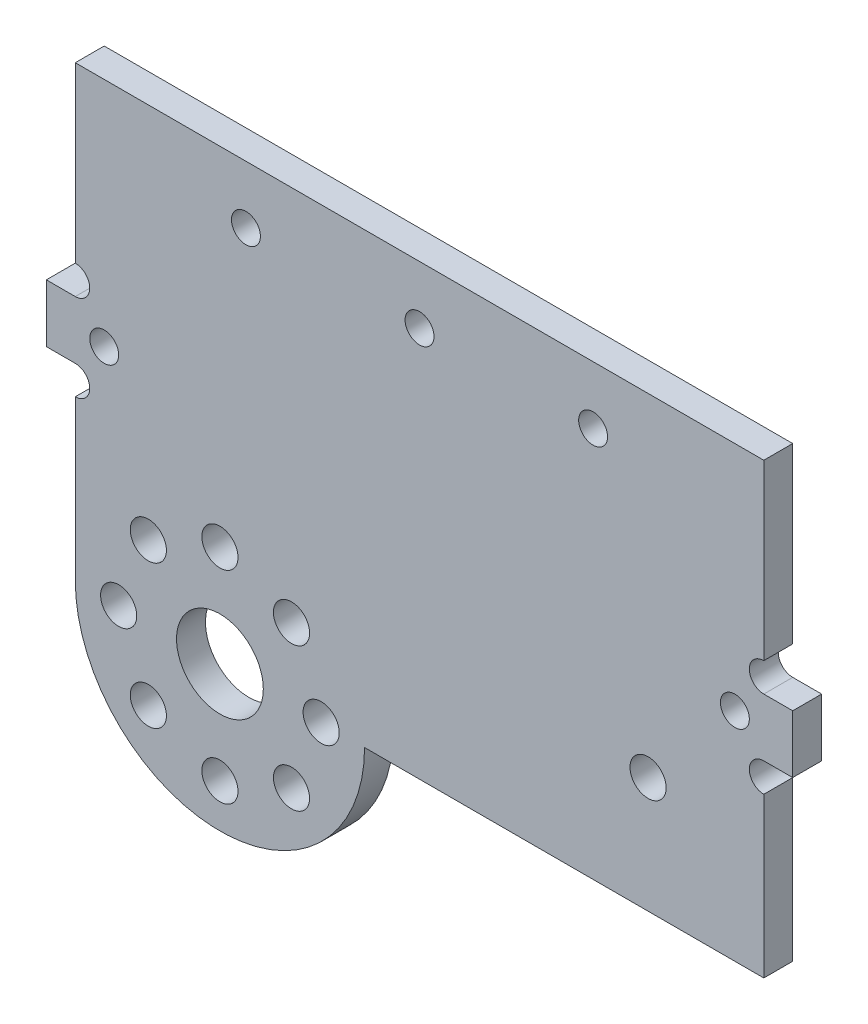
ISO-10303-21;
HEADER;
FILE_DESCRIPTION(('STEP AP214'),'2;1');
FILE_NAME('part.step','',(''),(''),'','','');
FILE_SCHEMA(('AUTOMOTIVE_DESIGN { 1 0 10303 214 1 1 1 1 }'));
ENDSEC;
DATA;
#1=APPLICATION_CONTEXT('core data for automotive mechanical design processes');
#2=APPLICATION_PROTOCOL_DEFINITION('international standard','automotive_design',2000,#1);
#3=PRODUCT_CONTEXT('',#1,'mechanical');
#4=PRODUCT('Part','Part','',(#3));
#5=PRODUCT_RELATED_PRODUCT_CATEGORY('part','',(#4));
#6=PRODUCT_DEFINITION_FORMATION('','',#4);
#7=PRODUCT_DEFINITION_CONTEXT('part definition',#1,'design');
#8=PRODUCT_DEFINITION('design','',#6,#7);
#9=PRODUCT_DEFINITION_SHAPE('','',#8);
#10=(LENGTH_UNIT() NAMED_UNIT(*) SI_UNIT(.MILLI.,.METRE.));
#11=(NAMED_UNIT(*) PLANE_ANGLE_UNIT() SI_UNIT($,.RADIAN.));
#12=(NAMED_UNIT(*) SI_UNIT($,.STERADIAN.) SOLID_ANGLE_UNIT());
#13=UNCERTAINTY_MEASURE_WITH_UNIT(LENGTH_MEASURE(1.E-05),#10,'distance_accuracy_value','');
#14=(GEOMETRIC_REPRESENTATION_CONTEXT(3) GLOBAL_UNCERTAINTY_ASSIGNED_CONTEXT((#13)) GLOBAL_UNIT_ASSIGNED_CONTEXT((#10,
#11,#12)) REPRESENTATION_CONTEXT('',''));
#15=CARTESIAN_POINT('',(0.,0.,0.));
#16=DIRECTION('',(0.,0.,1.));
#17=DIRECTION('',(1.,0.,0.));
#18=AXIS2_PLACEMENT_3D('',#15,#16,#17);
#19=CARTESIAN_POINT('',(19.0580949327945,4.88200589970501,2.));
#20=DIRECTION('',(0.,0.,-1.));
#21=DIRECTION('',(-1.,0.,0.));
#22=AXIS2_PLACEMENT_3D('',#19,#20,#21);
#23=PLANE('',#22);
#24=DIRECTION('',(-1.,0.,0.));
#25=VECTOR('',#24,1.);
#26=CARTESIAN_POINT('',(18.0580949327945,17.882005899705,2.));
#27=LINE('',#26,#25);
#28=CARTESIAN_POINT('',(19.0580949327945,17.882005899705,2.));
#29=VERTEX_POINT('',#28);
#30=CARTESIAN_POINT('',(-28.5419050672055,17.882005899705,2.));
#31=VERTEX_POINT('',#30);
#32=EDGE_CURVE('E114',#29,#31,#27,.T.);
#33=ORIENTED_EDGE('',*,*,#32,.T.);
#34=DIRECTION('',(0.,-1.,0.));
#35=VECTOR('',#34,1.);
#36=CARTESIAN_POINT('',(-28.5419050672055,17.882005899705,2.));
#37=LINE('',#36,#35);
#38=CARTESIAN_POINT('',(-28.5419050672055,5.88200589970501,2.));
#39=VERTEX_POINT('',#38);
#40=EDGE_CURVE('E311',#31,#39,#37,.T.);
#41=ORIENTED_EDGE('',*,*,#40,.T.);
#42=CARTESIAN_POINT('',(-28.5419050672055,4.88200589970501,2.));
#43=DIRECTION('',(0.,0.,-1.));
#44=DIRECTION('',(1.,0.,0.));
#45=AXIS2_PLACEMENT_3D('',#42,#43,#44);
#46=CIRCLE('',#45,1.);
#47=CARTESIAN_POINT('',(-28.5419050672055,3.88200589970501,2.));
#48=VERTEX_POINT('',#47);
#49=EDGE_CURVE('E260',#39,#48,#46,.T.);
#50=ORIENTED_EDGE('',*,*,#49,.T.);
#51=DIRECTION('',(-1.,0.,0.));
#52=VECTOR('',#51,1.);
#53=CARTESIAN_POINT('',(-28.5419050672055,3.88200589970501,2.));
#54=LINE('',#53,#52);
#55=CARTESIAN_POINT('',(-30.5419050672055,3.88200589970501,2.));
#56=VERTEX_POINT('',#55);
#57=EDGE_CURVE('E279',#48,#56,#54,.T.);
#58=ORIENTED_EDGE('',*,*,#57,.T.);
#59=DIRECTION('',(0.,-1.,0.));
#60=VECTOR('',#59,1.);
#61=CARTESIAN_POINT('',(-30.5419050672055,3.88200589970501,2.));
#62=LINE('',#61,#60);
#63=CARTESIAN_POINT('',(-30.5419050672055,-0.117994100294988,2.));
#64=VERTEX_POINT('',#63);
#65=EDGE_CURVE('E276',#56,#64,#62,.T.);
#66=ORIENTED_EDGE('',*,*,#65,.T.);
#67=DIRECTION('',(1.,0.,0.));
#68=VECTOR('',#67,1.);
#69=CARTESIAN_POINT('',(-28.5419050672055,-0.117994100294988,2.));
#70=LINE('',#69,#68);
#71=CARTESIAN_POINT('',(-28.5419050672055,-0.117994100294988,2.));
#72=VERTEX_POINT('',#71);
#73=EDGE_CURVE('E278',#64,#72,#70,.T.);
#74=ORIENTED_EDGE('',*,*,#73,.T.);
#75=CARTESIAN_POINT('',(-28.5419050672055,-1.11799410029499,2.));
#76=DIRECTION('',(0.,0.,-1.));
#77=DIRECTION('',(-1.,0.,0.));
#78=AXIS2_PLACEMENT_3D('',#75,#76,#77);
#79=CIRCLE('',#78,1.);
#80=CARTESIAN_POINT('',(-28.5419050672055,-2.11799410029499,2.));
#81=VERTEX_POINT('',#80);
#82=EDGE_CURVE('E281',#72,#81,#79,.T.);
#83=ORIENTED_EDGE('',*,*,#82,.T.);
#84=DIRECTION('',(0.,-1.,0.));
#85=VECTOR('',#84,1.);
#86=CARTESIAN_POINT('',(-28.5419050672055,-2.11799410029499,2.));
#87=LINE('',#86,#85);
#88=CARTESIAN_POINT('',(-28.5419050672055,-13.117994100295,2.));
#89=VERTEX_POINT('',#88);
#90=EDGE_CURVE('E287',#81,#89,#87,.T.);
#91=ORIENTED_EDGE('',*,*,#90,.T.);
#92=CARTESIAN_POINT('',(-18.5419050672055,-13.117994100295,2.));
#93=DIRECTION('',(0.,0.,1.));
#94=DIRECTION('',(1.,0.,0.));
#95=AXIS2_PLACEMENT_3D('',#92,#93,#94);
#96=CIRCLE('',#95,10.);
#97=CARTESIAN_POINT('',(-8.54190506720547,-13.117994100295,2.));
#98=VERTEX_POINT('',#97);
#99=EDGE_CURVE('E289',#89,#98,#96,.T.);
#100=ORIENTED_EDGE('',*,*,#99,.T.);
#101=DIRECTION('',(1.,0.,0.));
#102=VECTOR('',#101,1.);
#103=CARTESIAN_POINT('',(-8.54190506720547,-13.117994100295,2.));
#104=LINE('',#103,#102);
#105=CARTESIAN_POINT('',(19.0580949327945,-13.117994100295,2.));
#106=VERTEX_POINT('',#105);
#107=EDGE_CURVE('E291',#98,#106,#104,.T.);
#108=ORIENTED_EDGE('',*,*,#107,.T.);
#109=DIRECTION('',(0.,1.,0.));
#110=VECTOR('',#109,1.);
#111=CARTESIAN_POINT('',(19.0580949327945,-13.117994100295,2.));
#112=LINE('',#111,#110);
#113=CARTESIAN_POINT('',(19.0580949327945,-2.11799410029499,2.));
#114=VERTEX_POINT('',#113);
#115=EDGE_CURVE('E293',#106,#114,#112,.T.);
#116=ORIENTED_EDGE('',*,*,#115,.T.);
#117=CARTESIAN_POINT('',(19.0580949327945,-1.11799410029499,2.));
#118=DIRECTION('',(0.,0.,-1.));
#119=DIRECTION('',(1.,0.,0.));
#120=AXIS2_PLACEMENT_3D('',#117,#118,#119);
#121=CIRCLE('',#120,1.);
#122=CARTESIAN_POINT('',(19.0580949327945,-0.117994100294988,2.));
#123=VERTEX_POINT('',#122);
#124=EDGE_CURVE('E295',#114,#123,#121,.T.);
#125=ORIENTED_EDGE('',*,*,#124,.T.);
#126=DIRECTION('',(1.,0.,0.));
#127=VECTOR('',#126,1.);
#128=CARTESIAN_POINT('',(19.0580949327945,-0.117994100294988,2.));
#129=LINE('',#128,#127);
#130=CARTESIAN_POINT('',(21.0580949327945,-0.117994100294988,2.));
#131=VERTEX_POINT('',#130);
#132=EDGE_CURVE('E297',#123,#131,#129,.T.);
#133=ORIENTED_EDGE('',*,*,#132,.T.);
#134=DIRECTION('',(0.,1.,0.));
#135=VECTOR('',#134,1.);
#136=CARTESIAN_POINT('',(21.0580949327945,3.88200589970501,2.));
#137=LINE('',#136,#135);
#138=CARTESIAN_POINT('',(21.0580949327945,3.88200589970501,2.));
#139=VERTEX_POINT('',#138);
#140=EDGE_CURVE('E162',#131,#139,#137,.T.);
#141=ORIENTED_EDGE('',*,*,#140,.T.);
#142=DIRECTION('',(-1.,0.,0.));
#143=VECTOR('',#142,1.);
#144=CARTESIAN_POINT('',(19.0580949327945,3.88200589970501,2.));
#145=LINE('',#144,#143);
#146=CARTESIAN_POINT('',(19.0580949327945,3.88200589970501,2.));
#147=VERTEX_POINT('',#146);
#148=EDGE_CURVE('E155',#139,#147,#145,.T.);
#149=ORIENTED_EDGE('',*,*,#148,.T.);
#150=CARTESIAN_POINT('',(19.0580949327945,4.88200589970501,2.));
#151=DIRECTION('',(0.,0.,-1.));
#152=DIRECTION('',(-1.,0.,0.));
#153=AXIS2_PLACEMENT_3D('',#150,#151,#152);
#154=CIRCLE('',#153,1.);
#155=CARTESIAN_POINT('',(19.0580949327945,5.88200589970501,2.));
#156=VERTEX_POINT('',#155);
#157=EDGE_CURVE('E159',#147,#156,#154,.T.);
#158=ORIENTED_EDGE('',*,*,#157,.T.);
#159=DIRECTION('',(0.,1.,0.));
#160=VECTOR('',#159,1.);
#161=CARTESIAN_POINT('',(19.0580949327945,9.88200589970501,2.));
#162=LINE('',#161,#160);
#163=EDGE_CURVE('E49',#156,#29,#162,.T.);
#164=ORIENTED_EDGE('',*,*,#163,.T.);
#165=EDGE_LOOP('',(#33,#41,#50,#58,#66,#74,#83,#91,#100,#108,#116,#125,#133,#141,#149,#158,#164));
#166=FACE_BOUND('',#165,.T.);
#167=CARTESIAN_POINT('',(-18.5419050672055,-13.117994100295,2.));
#168=DIRECTION('',(0.,0.,1.));
#169=DIRECTION('',(1.,0.,0.));
#170=AXIS2_PLACEMENT_3D('',#167,#168,#169);
#171=CIRCLE('',#170,3.);
#172=CARTESIAN_POINT('',(-15.5419050672055,-13.117994100295,2.));
#173=VERTEX_POINT('',#172);
#174=EDGE_CURVE('E185',#173,#173,#171,.T.);
#175=ORIENTED_EDGE('',*,*,#174,.F.);
#176=EDGE_LOOP('',(#175));
#177=FACE_BOUND('',#176,.T.);
#178=CARTESIAN_POINT('',(-18.5419050672055,-6.11799410029498,2.));
#179=DIRECTION('',(0.,0.,1.));
#180=DIRECTION('',(1.,0.,0.));
#181=AXIS2_PLACEMENT_3D('',#178,#179,#180);
#182=CIRCLE('',#181,1.25);
#183=CARTESIAN_POINT('',(-17.2919050672055,-6.11799410029498,2.));
#184=VERTEX_POINT('',#183);
#185=EDGE_CURVE('E750',#184,#184,#182,.T.);
#186=ORIENTED_EDGE('',*,*,#185,.F.);
#187=EDGE_LOOP('',(#186));
#188=FACE_BOUND('',#187,.T.);
#189=CARTESIAN_POINT('',(-13.5921575988996,-8.16824663198902,2.));
#190=DIRECTION('',(0.,0.,1.));
#191=DIRECTION('',(1.,0.,0.));
#192=AXIS2_PLACEMENT_3D('',#189,#190,#191);
#193=CIRCLE('',#192,1.25);
#194=CARTESIAN_POINT('',(-12.3421575988996,-8.16824663198902,2.));
#195=VERTEX_POINT('',#194);
#196=EDGE_CURVE('E744',#195,#195,#193,.T.);
#197=ORIENTED_EDGE('',*,*,#196,.F.);
#198=EDGE_LOOP('',(#197));
#199=FACE_BOUND('',#198,.T.);
#200=CARTESIAN_POINT('',(-11.5419050672053,-13.1179941002948,2.));
#201=DIRECTION('',(0.,0.,1.));
#202=DIRECTION('',(1.,0.,0.));
#203=AXIS2_PLACEMENT_3D('',#200,#201,#202);
#204=CIRCLE('',#203,1.25);
#205=CARTESIAN_POINT('',(-10.2919050672053,-13.1179941002948,2.));
#206=VERTEX_POINT('',#205);
#207=EDGE_CURVE('E738',#206,#206,#204,.T.);
#208=ORIENTED_EDGE('',*,*,#207,.F.);
#209=EDGE_LOOP('',(#208));
#210=FACE_BOUND('',#209,.T.);
#211=CARTESIAN_POINT('',(-13.5921575988993,-18.0677415686007,2.));
#212=DIRECTION('',(0.,0.,1.));
#213=DIRECTION('',(1.,0.,0.));
#214=AXIS2_PLACEMENT_3D('',#211,#212,#213);
#215=CIRCLE('',#214,1.25);
#216=CARTESIAN_POINT('',(-12.3421575988993,-18.0677415686007,2.));
#217=VERTEX_POINT('',#216);
#218=EDGE_CURVE('E732',#217,#217,#215,.T.);
#219=ORIENTED_EDGE('',*,*,#218,.F.);
#220=EDGE_LOOP('',(#219));
#221=FACE_BOUND('',#220,.T.);
#222=CARTESIAN_POINT('',(-18.5419050672051,-20.117994100295,2.));
#223=DIRECTION('',(0.,0.,1.));
#224=DIRECTION('',(1.,0.,0.));
#225=AXIS2_PLACEMENT_3D('',#222,#223,#224);
#226=CIRCLE('',#225,1.25);
#227=CARTESIAN_POINT('',(-17.2919050672051,-20.117994100295,2.));
#228=VERTEX_POINT('',#227);
#229=EDGE_CURVE('E726',#228,#228,#226,.T.);
#230=ORIENTED_EDGE('',*,*,#229,.F.);
#231=EDGE_LOOP('',(#230));
#232=FACE_BOUND('',#231,.T.);
#233=CARTESIAN_POINT('',(-23.491652535511,-18.0677415686009,2.));
#234=DIRECTION('',(0.,0.,1.));
#235=DIRECTION('',(1.,0.,0.));
#236=AXIS2_PLACEMENT_3D('',#233,#234,#235);
#237=CIRCLE('',#236,1.25);
#238=CARTESIAN_POINT('',(-22.241652535511,-18.0677415686009,2.));
#239=VERTEX_POINT('',#238);
#240=EDGE_CURVE('E720',#239,#239,#237,.T.);
#241=ORIENTED_EDGE('',*,*,#240,.F.);
#242=EDGE_LOOP('',(#241));
#243=FACE_BOUND('',#242,.T.);
#244=CARTESIAN_POINT('',(-25.5419050672053,-13.1179941002951,2.));
#245=DIRECTION('',(0.,0.,1.));
#246=DIRECTION('',(1.,0.,0.));
#247=AXIS2_PLACEMENT_3D('',#244,#245,#246);
#248=CIRCLE('',#247,1.25);
#249=CARTESIAN_POINT('',(-24.2919050672053,-13.1179941002951,2.));
#250=VERTEX_POINT('',#249);
#251=EDGE_CURVE('E714',#250,#250,#248,.T.);
#252=ORIENTED_EDGE('',*,*,#251,.F.);
#253=EDGE_LOOP('',(#252));
#254=FACE_BOUND('',#253,.T.);
#255=CARTESIAN_POINT('',(-23.4916525355112,-8.16824663198923,2.));
#256=DIRECTION('',(0.,0.,1.));
#257=DIRECTION('',(1.,0.,0.));
#258=AXIS2_PLACEMENT_3D('',#255,#256,#257);
#259=CIRCLE('',#258,1.25);
#260=CARTESIAN_POINT('',(-22.2416525355112,-8.16824663198923,2.));
#261=VERTEX_POINT('',#260);
#262=EDGE_CURVE('E708',#261,#261,#259,.T.);
#263=ORIENTED_EDGE('',*,*,#262,.F.);
#264=EDGE_LOOP('',(#263));
#265=FACE_BOUND('',#264,.T.);
#266=CARTESIAN_POINT('',(-26.5419050672055,1.88200589970501,2.));
#267=DIRECTION('',(0.,0.,1.));
#268=DIRECTION('',(1.,0.,0.));
#269=AXIS2_PLACEMENT_3D('',#266,#267,#268);
#270=CIRCLE('',#269,1.);
#271=CARTESIAN_POINT('',(-25.5419050672055,1.88200589970501,2.));
#272=VERTEX_POINT('',#271);
#273=EDGE_CURVE('E702',#272,#272,#270,.T.);
#274=ORIENTED_EDGE('',*,*,#273,.F.);
#275=EDGE_LOOP('',(#274));
#276=FACE_BOUND('',#275,.T.);
#277=CARTESIAN_POINT('',(17.0580949327945,1.88200589970501,2.));
#278=DIRECTION('',(0.,0.,1.));
#279=DIRECTION('',(1.,0.,0.));
#280=AXIS2_PLACEMENT_3D('',#277,#278,#279);
#281=CIRCLE('',#280,1.);
#282=CARTESIAN_POINT('',(18.0580949327945,1.88200589970501,2.));
#283=VERTEX_POINT('',#282);
#284=EDGE_CURVE('E696',#283,#283,#281,.T.);
#285=ORIENTED_EDGE('',*,*,#284,.F.);
#286=EDGE_LOOP('',(#285));
#287=FACE_BOUND('',#286,.T.);
#288=CARTESIAN_POINT('',(-4.74190506720547,13.882005899705,2.));
#289=DIRECTION('',(0.,0.,1.));
#290=DIRECTION('',(1.,0.,0.));
#291=AXIS2_PLACEMENT_3D('',#288,#289,#290);
#292=CIRCLE('',#291,1.);
#293=CARTESIAN_POINT('',(-3.74190506720547,13.882005899705,2.));
#294=VERTEX_POINT('',#293);
#295=EDGE_CURVE('E690',#294,#294,#292,.T.);
#296=ORIENTED_EDGE('',*,*,#295,.F.);
#297=EDGE_LOOP('',(#296));
#298=FACE_BOUND('',#297,.T.);
#299=CARTESIAN_POINT('',(11.0580949327945,-5.11799410029498,2.));
#300=DIRECTION('',(0.,0.,1.));
#301=DIRECTION('',(1.,0.,0.));
#302=AXIS2_PLACEMENT_3D('',#299,#300,#301);
#303=CIRCLE('',#302,1.25);
#304=CARTESIAN_POINT('',(12.3080949327945,-5.11799410029498,2.));
#305=VERTEX_POINT('',#304);
#306=EDGE_CURVE('E684',#305,#305,#303,.T.);
#307=ORIENTED_EDGE('',*,*,#306,.F.);
#308=EDGE_LOOP('',(#307));
#309=FACE_BOUND('',#308,.T.);
#310=CARTESIAN_POINT('',(-16.7419050672055,13.882005899705,2.));
#311=DIRECTION('',(0.,0.,1.));
#312=DIRECTION('',(1.,0.,0.));
#313=AXIS2_PLACEMENT_3D('',#310,#311,#312);
#314=CIRCLE('',#313,1.);
#315=CARTESIAN_POINT('',(-15.7419050672055,13.882005899705,2.));
#316=VERTEX_POINT('',#315);
#317=EDGE_CURVE('E678',#316,#316,#314,.T.);
#318=ORIENTED_EDGE('',*,*,#317,.F.);
#319=EDGE_LOOP('',(#318));
#320=FACE_BOUND('',#319,.T.);
#321=CARTESIAN_POINT('',(7.25809493279453,13.882005899705,2.));
#322=DIRECTION('',(0.,0.,1.));
#323=DIRECTION('',(1.,0.,0.));
#324=AXIS2_PLACEMENT_3D('',#321,#322,#323);
#325=CIRCLE('',#324,1.);
#326=CARTESIAN_POINT('',(8.25809493279453,13.882005899705,2.));
#327=VERTEX_POINT('',#326);
#328=EDGE_CURVE('E669',#327,#327,#325,.T.);
#329=ORIENTED_EDGE('',*,*,#328,.F.);
#330=EDGE_LOOP('',(#329));
#331=FACE_BOUND('',#330,.T.);
#332=ADVANCED_FACE('F32',(#166,#177,#188,#199,#210,#221,#232,#243,#254,#265,#276,#287,#298,#309,
#320,#331),#23,.F.);
#333=CARTESIAN_POINT('',(19.0580949327945,4.88200589970501,0.));
#334=DIRECTION('',(0.,0.,-1.));
#335=DIRECTION('',(-1.,0.,0.));
#336=AXIS2_PLACEMENT_3D('',#333,#334,#335);
#337=PLANE('',#336);
#338=CARTESIAN_POINT('',(-16.7419050672055,13.882005899705,0.));
#339=DIRECTION('',(0.,0.,1.));
#340=DIRECTION('',(1.,0.,0.));
#341=AXIS2_PLACEMENT_3D('',#338,#339,#340);
#342=CIRCLE('',#341,1.);
#343=CARTESIAN_POINT('',(-15.7419050672055,13.882005899705,0.));
#344=VERTEX_POINT('',#343);
#345=EDGE_CURVE('E675',#344,#344,#342,.T.);
#346=ORIENTED_EDGE('',*,*,#345,.T.);
#347=EDGE_LOOP('',(#346));
#348=FACE_BOUND('',#347,.T.);
#349=CARTESIAN_POINT('',(-4.74190506720547,13.882005899705,0.));
#350=DIRECTION('',(0.,0.,1.));
#351=DIRECTION('',(1.,0.,0.));
#352=AXIS2_PLACEMENT_3D('',#349,#350,#351);
#353=CIRCLE('',#352,1.);
#354=CARTESIAN_POINT('',(-3.74190506720547,13.882005899705,0.));
#355=VERTEX_POINT('',#354);
#356=EDGE_CURVE('E687',#355,#355,#353,.T.);
#357=ORIENTED_EDGE('',*,*,#356,.T.);
#358=EDGE_LOOP('',(#357));
#359=FACE_BOUND('',#358,.T.);
#360=CARTESIAN_POINT('',(-26.5419050672055,1.88200589970501,0.));
#361=DIRECTION('',(0.,0.,1.));
#362=DIRECTION('',(1.,0.,0.));
#363=AXIS2_PLACEMENT_3D('',#360,#361,#362);
#364=CIRCLE('',#363,1.);
#365=CARTESIAN_POINT('',(-25.5419050672055,1.88200589970501,0.));
#366=VERTEX_POINT('',#365);
#367=EDGE_CURVE('E699',#366,#366,#364,.T.);
#368=ORIENTED_EDGE('',*,*,#367,.T.);
#369=EDGE_LOOP('',(#368));
#370=FACE_BOUND('',#369,.T.);
#371=CARTESIAN_POINT('',(-25.5419050672053,-13.1179941002951,0.));
#372=DIRECTION('',(0.,0.,1.));
#373=DIRECTION('',(1.,0.,0.));
#374=AXIS2_PLACEMENT_3D('',#371,#372,#373);
#375=CIRCLE('',#374,1.25);
#376=CARTESIAN_POINT('',(-24.2919050672053,-13.1179941002951,0.));
#377=VERTEX_POINT('',#376);
#378=EDGE_CURVE('E711',#377,#377,#375,.T.);
#379=ORIENTED_EDGE('',*,*,#378,.T.);
#380=EDGE_LOOP('',(#379));
#381=FACE_BOUND('',#380,.T.);
#382=CARTESIAN_POINT('',(-18.5419050672051,-20.117994100295,0.));
#383=DIRECTION('',(0.,0.,1.));
#384=DIRECTION('',(1.,0.,0.));
#385=AXIS2_PLACEMENT_3D('',#382,#383,#384);
#386=CIRCLE('',#385,1.25);
#387=CARTESIAN_POINT('',(-17.2919050672051,-20.117994100295,0.));
#388=VERTEX_POINT('',#387);
#389=EDGE_CURVE('E723',#388,#388,#386,.T.);
#390=ORIENTED_EDGE('',*,*,#389,.T.);
#391=EDGE_LOOP('',(#390));
#392=FACE_BOUND('',#391,.T.);
#393=CARTESIAN_POINT('',(-11.5419050672053,-13.1179941002948,0.));
#394=DIRECTION('',(0.,0.,1.));
#395=DIRECTION('',(1.,0.,0.));
#396=AXIS2_PLACEMENT_3D('',#393,#394,#395);
#397=CIRCLE('',#396,1.25);
#398=CARTESIAN_POINT('',(-10.2919050672053,-13.1179941002948,0.));
#399=VERTEX_POINT('',#398);
#400=EDGE_CURVE('E735',#399,#399,#397,.T.);
#401=ORIENTED_EDGE('',*,*,#400,.T.);
#402=EDGE_LOOP('',(#401));
#403=FACE_BOUND('',#402,.T.);
#404=CARTESIAN_POINT('',(-18.5419050672055,-6.11799410029498,0.));
#405=DIRECTION('',(0.,0.,1.));
#406=DIRECTION('',(1.,0.,0.));
#407=AXIS2_PLACEMENT_3D('',#404,#405,#406);
#408=CIRCLE('',#407,1.25);
#409=CARTESIAN_POINT('',(-17.2919050672055,-6.11799410029498,0.));
#410=VERTEX_POINT('',#409);
#411=EDGE_CURVE('E747',#410,#410,#408,.T.);
#412=ORIENTED_EDGE('',*,*,#411,.T.);
#413=EDGE_LOOP('',(#412));
#414=FACE_BOUND('',#413,.T.);
#415=DIRECTION('',(-1.,0.,0.));
#416=VECTOR('',#415,1.);
#417=CARTESIAN_POINT('',(-27.5419050672055,17.882005899705,0.));
#418=LINE('',#417,#416);
#419=CARTESIAN_POINT('',(19.0580949327945,17.882005899705,0.));
#420=VERTEX_POINT('',#419);
#421=CARTESIAN_POINT('',(-28.5419050672055,17.882005899705,0.));
#422=VERTEX_POINT('',#421);
#423=EDGE_CURVE('E109',#420,#422,#418,.T.);
#424=ORIENTED_EDGE('',*,*,#423,.F.);
#425=DIRECTION('',(0.,1.,0.));
#426=VECTOR('',#425,1.);
#427=CARTESIAN_POINT('',(19.0580949327945,17.882005899705,0.));
#428=LINE('',#427,#426);
#429=CARTESIAN_POINT('',(19.0580949327945,5.88200589970501,0.));
#430=VERTEX_POINT('',#429);
#431=EDGE_CURVE('E105',#430,#420,#428,.T.);
#432=ORIENTED_EDGE('',*,*,#431,.F.);
#433=CARTESIAN_POINT('',(19.0580949327945,4.88200589970501,0.));
#434=DIRECTION('',(0.,0.,-1.));
#435=DIRECTION('',(-1.,0.,0.));
#436=AXIS2_PLACEMENT_3D('',#433,#434,#435);
#437=CIRCLE('',#436,1.);
#438=CARTESIAN_POINT('',(19.0580949327945,3.88200589970501,0.));
#439=VERTEX_POINT('',#438);
#440=EDGE_CURVE('E214',#439,#430,#437,.T.);
#441=ORIENTED_EDGE('',*,*,#440,.F.);
#442=DIRECTION('',(-1.,0.,0.));
#443=VECTOR('',#442,1.);
#444=CARTESIAN_POINT('',(19.0580949327945,3.88200589970501,0.));
#445=LINE('',#444,#443);
#446=CARTESIAN_POINT('',(21.0580949327945,3.88200589970501,0.));
#447=VERTEX_POINT('',#446);
#448=EDGE_CURVE('E171',#447,#439,#445,.T.);
#449=ORIENTED_EDGE('',*,*,#448,.F.);
#450=DIRECTION('',(0.,1.,0.));
#451=VECTOR('',#450,1.);
#452=CARTESIAN_POINT('',(21.0580949327945,3.88200589970501,0.));
#453=LINE('',#452,#451);
#454=CARTESIAN_POINT('',(21.0580949327945,-0.117994100294988,0.));
#455=VERTEX_POINT('',#454);
#456=EDGE_CURVE('E211',#455,#447,#453,.T.);
#457=ORIENTED_EDGE('',*,*,#456,.F.);
#458=DIRECTION('',(1.,0.,0.));
#459=VECTOR('',#458,1.);
#460=CARTESIAN_POINT('',(19.0580949327945,-0.117994100294988,0.));
#461=LINE('',#460,#459);
#462=CARTESIAN_POINT('',(19.0580949327945,-0.117994100294988,0.));
#463=VERTEX_POINT('',#462);
#464=EDGE_CURVE('E209',#463,#455,#461,.T.);
#465=ORIENTED_EDGE('',*,*,#464,.F.);
#466=CARTESIAN_POINT('',(19.0580949327945,-1.11799410029499,0.));
#467=DIRECTION('',(0.,0.,-1.));
#468=DIRECTION('',(1.,0.,0.));
#469=AXIS2_PLACEMENT_3D('',#466,#467,#468);
#470=CIRCLE('',#469,1.);
#471=CARTESIAN_POINT('',(19.0580949327945,-2.11799410029499,0.));
#472=VERTEX_POINT('',#471);
#473=EDGE_CURVE('E207',#472,#463,#470,.T.);
#474=ORIENTED_EDGE('',*,*,#473,.F.);
#475=DIRECTION('',(0.,1.,0.));
#476=VECTOR('',#475,1.);
#477=CARTESIAN_POINT('',(19.0580949327945,-2.11799410029499,0.));
#478=LINE('',#477,#476);
#479=CARTESIAN_POINT('',(19.0580949327945,-13.117994100295,0.));
#480=VERTEX_POINT('',#479);
#481=EDGE_CURVE('E205',#480,#472,#478,.T.);
#482=ORIENTED_EDGE('',*,*,#481,.F.);
#483=DIRECTION('',(1.,0.,0.));
#484=VECTOR('',#483,1.);
#485=CARTESIAN_POINT('',(18.0580949327945,-13.117994100295,0.));
#486=LINE('',#485,#484);
#487=CARTESIAN_POINT('',(-8.54190506720547,-13.117994100295,0.));
#488=VERTEX_POINT('',#487);
#489=EDGE_CURVE('E202',#488,#480,#486,.T.);
#490=ORIENTED_EDGE('',*,*,#489,.F.);
#491=CARTESIAN_POINT('',(-18.5419050672055,-13.117994100295,0.));
#492=DIRECTION('',(0.,0.,1.));
#493=DIRECTION('',(1.,0.,0.));
#494=AXIS2_PLACEMENT_3D('',#491,#492,#493);
#495=CIRCLE('',#494,10.);
#496=CARTESIAN_POINT('',(-28.5419050672055,-13.117994100295,0.));
#497=VERTEX_POINT('',#496);
#498=EDGE_CURVE('E199',#497,#488,#495,.T.);
#499=ORIENTED_EDGE('',*,*,#498,.F.);
#500=DIRECTION('',(0.,-1.,0.));
#501=VECTOR('',#500,1.);
#502=CARTESIAN_POINT('',(-28.5419050672055,-2.11799410029499,0.));
#503=LINE('',#502,#501);
#504=CARTESIAN_POINT('',(-28.5419050672055,-2.11799410029499,0.));
#505=VERTEX_POINT('',#504);
#506=EDGE_CURVE('E197',#505,#497,#503,.T.);
#507=ORIENTED_EDGE('',*,*,#506,.F.);
#508=CARTESIAN_POINT('',(-28.5419050672055,-1.11799410029499,0.));
#509=DIRECTION('',(0.,0.,-1.));
#510=DIRECTION('',(-1.,0.,0.));
#511=AXIS2_PLACEMENT_3D('',#508,#509,#510);
#512=CIRCLE('',#511,1.);
#513=CARTESIAN_POINT('',(-28.5419050672055,-0.117994100294988,0.));
#514=VERTEX_POINT('',#513);
#515=EDGE_CURVE('E195',#514,#505,#512,.T.);
#516=ORIENTED_EDGE('',*,*,#515,.F.);
#517=DIRECTION('',(1.,0.,0.));
#518=VECTOR('',#517,1.);
#519=CARTESIAN_POINT('',(-28.5419050672055,-0.117994100294988,0.));
#520=LINE('',#519,#518);
#521=CARTESIAN_POINT('',(-30.5419050672055,-0.117994100294988,0.));
#522=VERTEX_POINT('',#521);
#523=EDGE_CURVE('E193',#522,#514,#520,.T.);
#524=ORIENTED_EDGE('',*,*,#523,.F.);
#525=DIRECTION('',(0.,-1.,0.));
#526=VECTOR('',#525,1.);
#527=CARTESIAN_POINT('',(-30.5419050672055,3.88200589970501,0.));
#528=LINE('',#527,#526);
#529=CARTESIAN_POINT('',(-30.5419050672055,3.88200589970501,0.));
#530=VERTEX_POINT('',#529);
#531=EDGE_CURVE('E191',#530,#522,#528,.T.);
#532=ORIENTED_EDGE('',*,*,#531,.F.);
#533=DIRECTION('',(-1.,0.,0.));
#534=VECTOR('',#533,1.);
#535=CARTESIAN_POINT('',(-28.5419050672055,3.88200589970501,0.));
#536=LINE('',#535,#534);
#537=CARTESIAN_POINT('',(-28.5419050672055,3.88200589970501,0.));
#538=VERTEX_POINT('',#537);
#539=EDGE_CURVE('E189',#538,#530,#536,.T.);
#540=ORIENTED_EDGE('',*,*,#539,.F.);
#541=CARTESIAN_POINT('',(-28.5419050672055,4.88200589970501,0.));
#542=DIRECTION('',(0.,0.,-1.));
#543=DIRECTION('',(1.,0.,0.));
#544=AXIS2_PLACEMENT_3D('',#541,#542,#543);
#545=CIRCLE('',#544,1.);
#546=CARTESIAN_POINT('',(-28.5419050672055,5.88200589970501,0.));
#547=VERTEX_POINT('',#546);
#548=EDGE_CURVE('E187',#547,#538,#545,.T.);
#549=ORIENTED_EDGE('',*,*,#548,.F.);
#550=DIRECTION('',(0.,-1.,0.));
#551=VECTOR('',#550,1.);
#552=CARTESIAN_POINT('',(-28.5419050672055,9.88200589970501,0.));
#553=LINE('',#552,#551);
#554=EDGE_CURVE('E184',#422,#547,#553,.T.);
#555=ORIENTED_EDGE('',*,*,#554,.F.);
#556=EDGE_LOOP('',(#424,#432,#441,#449,#457,#465,#474,#482,#490,#499,#507,#516,#524,#532,#540,
#549,#555));
#557=FACE_BOUND('',#556,.T.);
#558=CARTESIAN_POINT('',(-18.5419050672055,-13.117994100295,0.));
#559=DIRECTION('',(0.,0.,1.));
#560=DIRECTION('',(1.,0.,0.));
#561=AXIS2_PLACEMENT_3D('',#558,#559,#560);
#562=CIRCLE('',#561,3.);
#563=CARTESIAN_POINT('',(-15.5419050672055,-13.117994100295,0.));
#564=VERTEX_POINT('',#563);
#565=EDGE_CURVE('E315',#564,#564,#562,.T.);
#566=ORIENTED_EDGE('',*,*,#565,.T.);
#567=EDGE_LOOP('',(#566));
#568=FACE_BOUND('',#567,.T.);
#569=CARTESIAN_POINT('',(-13.5921575988996,-8.16824663198902,0.));
#570=DIRECTION('',(0.,0.,1.));
#571=DIRECTION('',(1.,0.,0.));
#572=AXIS2_PLACEMENT_3D('',#569,#570,#571);
#573=CIRCLE('',#572,1.25);
#574=CARTESIAN_POINT('',(-12.3421575988996,-8.16824663198902,0.));
#575=VERTEX_POINT('',#574);
#576=EDGE_CURVE('E741',#575,#575,#573,.T.);
#577=ORIENTED_EDGE('',*,*,#576,.T.);
#578=EDGE_LOOP('',(#577));
#579=FACE_BOUND('',#578,.T.);
#580=CARTESIAN_POINT('',(-13.5921575988993,-18.0677415686007,0.));
#581=DIRECTION('',(0.,0.,1.));
#582=DIRECTION('',(1.,0.,0.));
#583=AXIS2_PLACEMENT_3D('',#580,#581,#582);
#584=CIRCLE('',#583,1.25);
#585=CARTESIAN_POINT('',(-12.3421575988993,-18.0677415686007,0.));
#586=VERTEX_POINT('',#585);
#587=EDGE_CURVE('E729',#586,#586,#584,.T.);
#588=ORIENTED_EDGE('',*,*,#587,.T.);
#589=EDGE_LOOP('',(#588));
#590=FACE_BOUND('',#589,.T.);
#591=CARTESIAN_POINT('',(-23.491652535511,-18.0677415686009,0.));
#592=DIRECTION('',(0.,0.,1.));
#593=DIRECTION('',(1.,0.,0.));
#594=AXIS2_PLACEMENT_3D('',#591,#592,#593);
#595=CIRCLE('',#594,1.25);
#596=CARTESIAN_POINT('',(-22.241652535511,-18.0677415686009,0.));
#597=VERTEX_POINT('',#596);
#598=EDGE_CURVE('E717',#597,#597,#595,.T.);
#599=ORIENTED_EDGE('',*,*,#598,.T.);
#600=EDGE_LOOP('',(#599));
#601=FACE_BOUND('',#600,.T.);
#602=CARTESIAN_POINT('',(-23.4916525355112,-8.16824663198923,0.));
#603=DIRECTION('',(0.,0.,1.));
#604=DIRECTION('',(1.,0.,0.));
#605=AXIS2_PLACEMENT_3D('',#602,#603,#604);
#606=CIRCLE('',#605,1.25);
#607=CARTESIAN_POINT('',(-22.2416525355112,-8.16824663198923,0.));
#608=VERTEX_POINT('',#607);
#609=EDGE_CURVE('E705',#608,#608,#606,.T.);
#610=ORIENTED_EDGE('',*,*,#609,.T.);
#611=EDGE_LOOP('',(#610));
#612=FACE_BOUND('',#611,.T.);
#613=CARTESIAN_POINT('',(17.0580949327945,1.88200589970501,0.));
#614=DIRECTION('',(0.,0.,1.));
#615=DIRECTION('',(1.,0.,0.));
#616=AXIS2_PLACEMENT_3D('',#613,#614,#615);
#617=CIRCLE('',#616,1.);
#618=CARTESIAN_POINT('',(18.0580949327945,1.88200589970501,0.));
#619=VERTEX_POINT('',#618);
#620=EDGE_CURVE('E693',#619,#619,#617,.T.);
#621=ORIENTED_EDGE('',*,*,#620,.T.);
#622=EDGE_LOOP('',(#621));
#623=FACE_BOUND('',#622,.T.);
#624=CARTESIAN_POINT('',(11.0580949327945,-5.11799410029498,0.));
#625=DIRECTION('',(0.,0.,1.));
#626=DIRECTION('',(1.,0.,0.));
#627=AXIS2_PLACEMENT_3D('',#624,#625,#626);
#628=CIRCLE('',#627,1.25);
#629=CARTESIAN_POINT('',(12.3080949327945,-5.11799410029498,0.));
#630=VERTEX_POINT('',#629);
#631=EDGE_CURVE('E681',#630,#630,#628,.T.);
#632=ORIENTED_EDGE('',*,*,#631,.T.);
#633=EDGE_LOOP('',(#632));
#634=FACE_BOUND('',#633,.T.);
#635=CARTESIAN_POINT('',(7.25809493279453,13.882005899705,0.));
#636=DIRECTION('',(0.,0.,1.));
#637=DIRECTION('',(1.,0.,0.));
#638=AXIS2_PLACEMENT_3D('',#635,#636,#637);
#639=CIRCLE('',#638,1.);
#640=CARTESIAN_POINT('',(8.25809493279453,13.882005899705,0.));
#641=VERTEX_POINT('',#640);
#642=EDGE_CURVE('E672',#641,#641,#639,.T.);
#643=ORIENTED_EDGE('',*,*,#642,.T.);
#644=EDGE_LOOP('',(#643));
#645=FACE_BOUND('',#644,.T.);
#646=ADVANCED_FACE('F264',(#348,#359,#370,#381,#392,#403,#414,#557,#568,#579,#590,#601,#612,
#623,#634,#645),#337,.T.);
#647=CARTESIAN_POINT('',(-27.5419050672055,17.882005899705,2.));
#648=DIRECTION('',(0.,-1.,0.));
#649=DIRECTION('',(0.,0.,-1.));
#650=AXIS2_PLACEMENT_3D('',#647,#648,#649);
#651=PLANE('',#650);
#652=ORIENTED_EDGE('',*,*,#423,.T.);
#653=DIRECTION('',(0.,0.,-1.));
#654=VECTOR('',#653,1.);
#655=CARTESIAN_POINT('',(-28.5419050672055,17.882005899705,2.));
#656=LINE('',#655,#654);
#657=EDGE_CURVE('E11',#31,#422,#656,.T.);
#658=ORIENTED_EDGE('',*,*,#657,.F.);
#659=ORIENTED_EDGE('',*,*,#32,.F.);
#660=DIRECTION('',(0.,0.,-1.));
#661=VECTOR('',#660,1.);
#662=CARTESIAN_POINT('',(19.0580949327945,17.882005899705,2.));
#663=LINE('',#662,#661);
#664=EDGE_CURVE('E179',#29,#420,#663,.T.);
#665=ORIENTED_EDGE('',*,*,#664,.T.);
#666=EDGE_LOOP('',(#652,#658,#659,#665));
#667=FACE_BOUND('',#666,.T.);
#668=ADVANCED_FACE('F34',(#667),#651,.F.);
#669=CARTESIAN_POINT('',(-28.5419050672055,9.88200589970501,2.));
#670=DIRECTION('',(1.,0.,0.));
#671=DIRECTION('',(0.,1.,0.));
#672=AXIS2_PLACEMENT_3D('',#669,#670,#671);
#673=PLANE('',#672);
#674=ORIENTED_EDGE('',*,*,#554,.T.);
#675=DIRECTION('',(0.,0.,-1.));
#676=VECTOR('',#675,1.);
#677=CARTESIAN_POINT('',(-28.5419050672055,5.88200589970501,2.));
#678=LINE('',#677,#676);
#679=EDGE_CURVE('E41',#39,#547,#678,.T.);
#680=ORIENTED_EDGE('',*,*,#679,.F.);
#681=ORIENTED_EDGE('',*,*,#40,.F.);
#682=ORIENTED_EDGE('',*,*,#657,.T.);
#683=EDGE_LOOP('',(#674,#680,#681,#682));
#684=FACE_BOUND('',#683,.T.);
#685=ADVANCED_FACE('F317',(#684),#673,.F.);
#686=CARTESIAN_POINT('',(-28.5419050672055,4.88200589970501,2.));
#687=DIRECTION('',(0.,0.,-1.));
#688=DIRECTION('',(-1.,0.,0.));
#689=AXIS2_PLACEMENT_3D('',#686,#687,#688);
#690=CYLINDRICAL_SURFACE('',#689,1.);
#691=ORIENTED_EDGE('',*,*,#548,.T.);
#692=DIRECTION('',(0.,0.,-1.));
#693=VECTOR('',#692,1.);
#694=CARTESIAN_POINT('',(-28.5419050672055,3.88200589970501,2.));
#695=LINE('',#694,#693);
#696=EDGE_CURVE('E251',#48,#538,#695,.T.);
#697=ORIENTED_EDGE('',*,*,#696,.F.);
#698=ORIENTED_EDGE('',*,*,#49,.F.);
#699=ORIENTED_EDGE('',*,*,#679,.T.);
#700=EDGE_LOOP('',(#691,#697,#698,#699));
#701=FACE_BOUND('',#700,.T.);
#702=ADVANCED_FACE('F258',(#701),#690,.F.);
#703=CARTESIAN_POINT('',(-28.5419050672055,3.88200589970501,2.));
#704=DIRECTION('',(0.,-1.,0.));
#705=DIRECTION('',(1.,0.,0.));
#706=AXIS2_PLACEMENT_3D('',#703,#704,#705);
#707=PLANE('',#706);
#708=ORIENTED_EDGE('',*,*,#539,.T.);
#709=DIRECTION('',(0.,0.,-1.));
#710=VECTOR('',#709,1.);
#711=CARTESIAN_POINT('',(-30.5419050672055,3.88200589970501,2.));
#712=LINE('',#711,#710);
#713=EDGE_CURVE('E248',#56,#530,#712,.T.);
#714=ORIENTED_EDGE('',*,*,#713,.F.);
#715=ORIENTED_EDGE('',*,*,#57,.F.);
#716=ORIENTED_EDGE('',*,*,#696,.T.);
#717=EDGE_LOOP('',(#708,#714,#715,#716));
#718=FACE_BOUND('',#717,.T.);
#719=ADVANCED_FACE('F270',(#718),#707,.F.);
#720=CARTESIAN_POINT('',(-30.5419050672055,3.88200589970501,2.));
#721=DIRECTION('',(1.,0.,0.));
#722=DIRECTION('',(0.,0.,-1.));
#723=AXIS2_PLACEMENT_3D('',#720,#721,#722);
#724=PLANE('',#723);
#725=ORIENTED_EDGE('',*,*,#531,.T.);
#726=DIRECTION('',(0.,0.,-1.));
#727=VECTOR('',#726,1.);
#728=CARTESIAN_POINT('',(-30.5419050672055,-0.117994100294988,2.));
#729=LINE('',#728,#727);
#730=EDGE_CURVE('E245',#64,#522,#729,.T.);
#731=ORIENTED_EDGE('',*,*,#730,.F.);
#732=ORIENTED_EDGE('',*,*,#65,.F.);
#733=ORIENTED_EDGE('',*,*,#713,.T.);
#734=EDGE_LOOP('',(#725,#731,#732,#733));
#735=FACE_BOUND('',#734,.T.);
#736=ADVANCED_FACE('F274',(#735),#724,.F.);
#737=CARTESIAN_POINT('',(-28.5419050672055,-0.117994100294988,2.));
#738=DIRECTION('',(0.,1.,0.));
#739=DIRECTION('',(-1.,0.,0.));
#740=AXIS2_PLACEMENT_3D('',#737,#738,#739);
#741=PLANE('',#740);
#742=ORIENTED_EDGE('',*,*,#523,.T.);
#743=DIRECTION('',(0.,0.,-1.));
#744=VECTOR('',#743,1.);
#745=CARTESIAN_POINT('',(-28.5419050672055,-0.117994100294988,2.));
#746=LINE('',#745,#744);
#747=EDGE_CURVE('E242',#72,#514,#746,.T.);
#748=ORIENTED_EDGE('',*,*,#747,.F.);
#749=ORIENTED_EDGE('',*,*,#73,.F.);
#750=ORIENTED_EDGE('',*,*,#730,.T.);
#751=EDGE_LOOP('',(#742,#748,#749,#750));
#752=FACE_BOUND('',#751,.T.);
#753=ADVANCED_FACE('F368',(#752),#741,.F.);
#754=CARTESIAN_POINT('',(-28.5419050672055,-1.11799410029499,2.));
#755=DIRECTION('',(0.,0.,-1.));
#756=DIRECTION('',(-1.,0.,0.));
#757=AXIS2_PLACEMENT_3D('',#754,#755,#756);
#758=CYLINDRICAL_SURFACE('',#757,1.);
#759=ORIENTED_EDGE('',*,*,#515,.T.);
#760=DIRECTION('',(0.,0.,-1.));
#761=VECTOR('',#760,1.);
#762=CARTESIAN_POINT('',(-28.5419050672055,-2.11799410029499,2.));
#763=LINE('',#762,#761);
#764=EDGE_CURVE('E239',#81,#505,#763,.T.);
#765=ORIENTED_EDGE('',*,*,#764,.F.);
#766=ORIENTED_EDGE('',*,*,#82,.F.);
#767=ORIENTED_EDGE('',*,*,#747,.T.);
#768=EDGE_LOOP('',(#759,#765,#766,#767));
#769=FACE_BOUND('',#768,.T.);
#770=ADVANCED_FACE('F364',(#769),#758,.F.);
#771=CARTESIAN_POINT('',(-28.5419050672055,-2.11799410029499,2.));
#772=DIRECTION('',(1.,0.,0.));
#773=DIRECTION('',(0.,1.,0.));
#774=AXIS2_PLACEMENT_3D('',#771,#772,#773);
#775=PLANE('',#774);
#776=ORIENTED_EDGE('',*,*,#506,.T.);
#777=DIRECTION('',(0.,0.,-1.));
#778=VECTOR('',#777,1.);
#779=CARTESIAN_POINT('',(-28.5419050672055,-13.117994100295,2.));
#780=LINE('',#779,#778);
#781=EDGE_CURVE('E236',#89,#497,#780,.T.);
#782=ORIENTED_EDGE('',*,*,#781,.F.);
#783=ORIENTED_EDGE('',*,*,#90,.F.);
#784=ORIENTED_EDGE('',*,*,#764,.T.);
#785=EDGE_LOOP('',(#776,#782,#783,#784));
#786=FACE_BOUND('',#785,.T.);
#787=ADVANCED_FACE('F360',(#786),#775,.F.);
#788=CARTESIAN_POINT('',(-18.5419050672055,-13.117994100295,2.));
#789=DIRECTION('',(0.,0.,-1.));
#790=DIRECTION('',(-1.,0.,0.));
#791=AXIS2_PLACEMENT_3D('',#788,#789,#790);
#792=CYLINDRICAL_SURFACE('',#791,10.);
#793=ORIENTED_EDGE('',*,*,#498,.T.);
#794=DIRECTION('',(0.,0.,-1.));
#795=VECTOR('',#794,1.);
#796=CARTESIAN_POINT('',(-8.54190506720547,-13.117994100295,2.));
#797=LINE('',#796,#795);
#798=EDGE_CURVE('E233',#98,#488,#797,.T.);
#799=ORIENTED_EDGE('',*,*,#798,.F.);
#800=ORIENTED_EDGE('',*,*,#99,.F.);
#801=ORIENTED_EDGE('',*,*,#781,.T.);
#802=EDGE_LOOP('',(#793,#799,#800,#801));
#803=FACE_BOUND('',#802,.T.);
#804=ADVANCED_FACE('F356',(#803),#792,.T.);
#805=CARTESIAN_POINT('',(18.0580949327945,-13.117994100295,2.));
#806=DIRECTION('',(0.,1.,0.));
#807=DIRECTION('',(0.,0.,1.));
#808=AXIS2_PLACEMENT_3D('',#805,#806,#807);
#809=PLANE('',#808);
#810=ORIENTED_EDGE('',*,*,#489,.T.);
#811=DIRECTION('',(0.,0.,-1.));
#812=VECTOR('',#811,1.);
#813=CARTESIAN_POINT('',(19.0580949327945,-13.117994100295,2.));
#814=LINE('',#813,#812);
#815=EDGE_CURVE('E230',#106,#480,#814,.T.);
#816=ORIENTED_EDGE('',*,*,#815,.F.);
#817=ORIENTED_EDGE('',*,*,#107,.F.);
#818=ORIENTED_EDGE('',*,*,#798,.T.);
#819=EDGE_LOOP('',(#810,#816,#817,#818));
#820=FACE_BOUND('',#819,.T.);
#821=ADVANCED_FACE('F352',(#820),#809,.F.);
#822=CARTESIAN_POINT('',(19.0580949327945,-2.11799410029499,2.));
#823=DIRECTION('',(-1.,0.,0.));
#824=DIRECTION('',(0.,0.,1.));
#825=AXIS2_PLACEMENT_3D('',#822,#823,#824);
#826=PLANE('',#825);
#827=ORIENTED_EDGE('',*,*,#481,.T.);
#828=DIRECTION('',(0.,0.,-1.));
#829=VECTOR('',#828,1.);
#830=CARTESIAN_POINT('',(19.0580949327945,-2.11799410029499,2.));
#831=LINE('',#830,#829);
#832=EDGE_CURVE('E227',#114,#472,#831,.T.);
#833=ORIENTED_EDGE('',*,*,#832,.F.);
#834=ORIENTED_EDGE('',*,*,#115,.F.);
#835=ORIENTED_EDGE('',*,*,#815,.T.);
#836=EDGE_LOOP('',(#827,#833,#834,#835));
#837=FACE_BOUND('',#836,.T.);
#838=ADVANCED_FACE('F348',(#837),#826,.F.);
#839=CARTESIAN_POINT('',(19.0580949327945,-1.11799410029499,2.));
#840=DIRECTION('',(0.,0.,-1.));
#841=DIRECTION('',(-1.,0.,0.));
#842=AXIS2_PLACEMENT_3D('',#839,#840,#841);
#843=CYLINDRICAL_SURFACE('',#842,1.);
#844=ORIENTED_EDGE('',*,*,#473,.T.);
#845=DIRECTION('',(0.,0.,-1.));
#846=VECTOR('',#845,1.);
#847=CARTESIAN_POINT('',(19.0580949327945,-0.117994100294988,2.));
#848=LINE('',#847,#846);
#849=EDGE_CURVE('E224',#123,#463,#848,.T.);
#850=ORIENTED_EDGE('',*,*,#849,.F.);
#851=ORIENTED_EDGE('',*,*,#124,.F.);
#852=ORIENTED_EDGE('',*,*,#832,.T.);
#853=EDGE_LOOP('',(#844,#850,#851,#852));
#854=FACE_BOUND('',#853,.T.);
#855=ADVANCED_FACE('F345',(#854),#843,.F.);
#856=CARTESIAN_POINT('',(19.0580949327945,-0.117994100294988,2.));
#857=DIRECTION('',(0.,1.,0.));
#858=DIRECTION('',(-1.,0.,0.));
#859=AXIS2_PLACEMENT_3D('',#856,#857,#858);
#860=PLANE('',#859);
#861=ORIENTED_EDGE('',*,*,#464,.T.);
#862=DIRECTION('',(0.,0.,-1.));
#863=VECTOR('',#862,1.);
#864=CARTESIAN_POINT('',(21.0580949327945,-0.117994100294988,2.));
#865=LINE('',#864,#863);
#866=EDGE_CURVE('E221',#131,#455,#865,.T.);
#867=ORIENTED_EDGE('',*,*,#866,.F.);
#868=ORIENTED_EDGE('',*,*,#132,.F.);
#869=ORIENTED_EDGE('',*,*,#849,.T.);
#870=EDGE_LOOP('',(#861,#867,#868,#869));
#871=FACE_BOUND('',#870,.T.);
#872=ADVANCED_FACE('F303',(#871),#860,.F.);
#873=CARTESIAN_POINT('',(21.0580949327945,3.88200589970501,2.));
#874=DIRECTION('',(-1.,0.,0.));
#875=DIRECTION('',(0.,0.,1.));
#876=AXIS2_PLACEMENT_3D('',#873,#874,#875);
#877=PLANE('',#876);
#878=ORIENTED_EDGE('',*,*,#456,.T.);
#879=DIRECTION('',(0.,0.,-1.));
#880=VECTOR('',#879,1.);
#881=CARTESIAN_POINT('',(21.0580949327945,3.88200589970501,2.));
#882=LINE('',#881,#880);
#883=EDGE_CURVE('E173',#139,#447,#882,.T.);
#884=ORIENTED_EDGE('',*,*,#883,.F.);
#885=ORIENTED_EDGE('',*,*,#140,.F.);
#886=ORIENTED_EDGE('',*,*,#866,.T.);
#887=EDGE_LOOP('',(#878,#884,#885,#886));
#888=FACE_BOUND('',#887,.T.);
#889=ADVANCED_FACE('F307',(#888),#877,.F.);
#890=CARTESIAN_POINT('',(19.0580949327945,3.88200589970501,2.));
#891=DIRECTION('',(0.,-1.,0.));
#892=DIRECTION('',(1.,0.,0.));
#893=AXIS2_PLACEMENT_3D('',#890,#891,#892);
#894=PLANE('',#893);
#895=ORIENTED_EDGE('',*,*,#448,.T.);
#896=DIRECTION('',(0.,0.,-1.));
#897=VECTOR('',#896,1.);
#898=CARTESIAN_POINT('',(19.0580949327945,3.88200589970501,2.));
#899=LINE('',#898,#897);
#900=EDGE_CURVE('E168',#147,#439,#899,.T.);
#901=ORIENTED_EDGE('',*,*,#900,.F.);
#902=ORIENTED_EDGE('',*,*,#148,.F.);
#903=ORIENTED_EDGE('',*,*,#883,.T.);
#904=EDGE_LOOP('',(#895,#901,#902,#903));
#905=FACE_BOUND('',#904,.T.);
#906=ADVANCED_FACE('F169',(#905),#894,.F.);
#907=CARTESIAN_POINT('',(19.0580949327945,4.88200589970501,2.));
#908=DIRECTION('',(0.,0.,-1.));
#909=DIRECTION('',(-1.,0.,0.));
#910=AXIS2_PLACEMENT_3D('',#907,#908,#909);
#911=CYLINDRICAL_SURFACE('',#910,1.);
#912=ORIENTED_EDGE('',*,*,#440,.T.);
#913=DIRECTION('',(0.,0.,-1.));
#914=VECTOR('',#913,1.);
#915=CARTESIAN_POINT('',(19.0580949327945,5.88200589970501,2.));
#916=LINE('',#915,#914);
#917=EDGE_CURVE('E174',#156,#430,#916,.T.);
#918=ORIENTED_EDGE('',*,*,#917,.F.);
#919=ORIENTED_EDGE('',*,*,#157,.F.);
#920=ORIENTED_EDGE('',*,*,#900,.T.);
#921=EDGE_LOOP('',(#912,#918,#919,#920));
#922=FACE_BOUND('',#921,.T.);
#923=ADVANCED_FACE('F176',(#922),#911,.F.);
#924=CARTESIAN_POINT('',(19.0580949327945,17.882005899705,2.));
#925=DIRECTION('',(-1.,0.,0.));
#926=DIRECTION('',(0.,0.,1.));
#927=AXIS2_PLACEMENT_3D('',#924,#925,#926);
#928=PLANE('',#927);
#929=ORIENTED_EDGE('',*,*,#431,.T.);
#930=ORIENTED_EDGE('',*,*,#664,.F.);
#931=ORIENTED_EDGE('',*,*,#163,.F.);
#932=ORIENTED_EDGE('',*,*,#917,.T.);
#933=EDGE_LOOP('',(#929,#930,#931,#932));
#934=FACE_BOUND('',#933,.T.);
#935=ADVANCED_FACE('F309',(#934),#928,.F.);
#936=CARTESIAN_POINT('',(-18.5419050672055,-13.117994100295,2.));
#937=DIRECTION('',(0.,0.,-1.));
#938=DIRECTION('',(-1.,0.,0.));
#939=AXIS2_PLACEMENT_3D('',#936,#937,#938);
#940=CYLINDRICAL_SURFACE('',#939,3.);
#941=ORIENTED_EDGE('',*,*,#174,.T.);
#942=EDGE_LOOP('',(#941));
#943=FACE_BOUND('',#942,.T.);
#944=ORIENTED_EDGE('',*,*,#565,.F.);
#945=EDGE_LOOP('',(#944));
#946=FACE_BOUND('',#945,.T.);
#947=ADVANCED_FACE('F332',(#943,#946),#940,.F.);
#948=CARTESIAN_POINT('',(-18.5419050672055,-6.11799410029498,2.));
#949=DIRECTION('',(0.,0.,-1.));
#950=DIRECTION('',(-1.,0.,0.));
#951=AXIS2_PLACEMENT_3D('',#948,#949,#950);
#952=CYLINDRICAL_SURFACE('',#951,1.25);
#953=ORIENTED_EDGE('',*,*,#185,.T.);
#954=EDGE_LOOP('',(#953));
#955=FACE_BOUND('',#954,.T.);
#956=ORIENTED_EDGE('',*,*,#411,.F.);
#957=EDGE_LOOP('',(#956));
#958=FACE_BOUND('',#957,.T.);
#959=ADVANCED_FACE('F438',(#955,#958),#952,.F.);
#960=CARTESIAN_POINT('',(-13.5921575988996,-8.16824663198902,2.));
#961=DIRECTION('',(0.,0.,-1.));
#962=DIRECTION('',(-1.,0.,0.));
#963=AXIS2_PLACEMENT_3D('',#960,#961,#962);
#964=CYLINDRICAL_SURFACE('',#963,1.25);
#965=ORIENTED_EDGE('',*,*,#196,.T.);
#966=EDGE_LOOP('',(#965));
#967=FACE_BOUND('',#966,.T.);
#968=ORIENTED_EDGE('',*,*,#576,.F.);
#969=EDGE_LOOP('',(#968));
#970=FACE_BOUND('',#969,.T.);
#971=ADVANCED_FACE('F445',(#967,#970),#964,.F.);
#972=CARTESIAN_POINT('',(-11.5419050672053,-13.1179941002948,2.));
#973=DIRECTION('',(0.,0.,-1.));
#974=DIRECTION('',(-1.,0.,0.));
#975=AXIS2_PLACEMENT_3D('',#972,#973,#974);
#976=CYLINDRICAL_SURFACE('',#975,1.25);
#977=ORIENTED_EDGE('',*,*,#207,.T.);
#978=EDGE_LOOP('',(#977));
#979=FACE_BOUND('',#978,.T.);
#980=ORIENTED_EDGE('',*,*,#400,.F.);
#981=EDGE_LOOP('',(#980));
#982=FACE_BOUND('',#981,.T.);
#983=ADVANCED_FACE('F452',(#979,#982),#976,.F.);
#984=CARTESIAN_POINT('',(-13.5921575988993,-18.0677415686007,2.));
#985=DIRECTION('',(0.,0.,-1.));
#986=DIRECTION('',(-1.,0.,0.));
#987=AXIS2_PLACEMENT_3D('',#984,#985,#986);
#988=CYLINDRICAL_SURFACE('',#987,1.25);
#989=ORIENTED_EDGE('',*,*,#218,.T.);
#990=EDGE_LOOP('',(#989));
#991=FACE_BOUND('',#990,.T.);
#992=ORIENTED_EDGE('',*,*,#587,.F.);
#993=EDGE_LOOP('',(#992));
#994=FACE_BOUND('',#993,.T.);
#995=ADVANCED_FACE('F460',(#991,#994),#988,.F.);
#996=CARTESIAN_POINT('',(-18.5419050672051,-20.117994100295,2.));
#997=DIRECTION('',(0.,0.,-1.));
#998=DIRECTION('',(-1.,0.,0.));
#999=AXIS2_PLACEMENT_3D('',#996,#997,#998);
#1000=CYLINDRICAL_SURFACE('',#999,1.25);
#1001=ORIENTED_EDGE('',*,*,#229,.T.);
#1002=EDGE_LOOP('',(#1001));
#1003=FACE_BOUND('',#1002,.T.);
#1004=ORIENTED_EDGE('',*,*,#389,.F.);
#1005=EDGE_LOOP('',(#1004));
#1006=FACE_BOUND('',#1005,.T.);
#1007=ADVANCED_FACE('F468',(#1003,#1006),#1000,.F.);
#1008=CARTESIAN_POINT('',(-23.491652535511,-18.0677415686009,2.));
#1009=DIRECTION('',(0.,0.,-1.));
#1010=DIRECTION('',(-1.,0.,0.));
#1011=AXIS2_PLACEMENT_3D('',#1008,#1009,#1010);
#1012=CYLINDRICAL_SURFACE('',#1011,1.25);
#1013=ORIENTED_EDGE('',*,*,#240,.T.);
#1014=EDGE_LOOP('',(#1013));
#1015=FACE_BOUND('',#1014,.T.);
#1016=ORIENTED_EDGE('',*,*,#598,.F.);
#1017=EDGE_LOOP('',(#1016));
#1018=FACE_BOUND('',#1017,.T.);
#1019=ADVANCED_FACE('F476',(#1015,#1018),#1012,.F.);
#1020=CARTESIAN_POINT('',(-25.5419050672053,-13.1179941002951,2.));
#1021=DIRECTION('',(0.,0.,-1.));
#1022=DIRECTION('',(-1.,0.,0.));
#1023=AXIS2_PLACEMENT_3D('',#1020,#1021,#1022);
#1024=CYLINDRICAL_SURFACE('',#1023,1.25);
#1025=ORIENTED_EDGE('',*,*,#251,.T.);
#1026=EDGE_LOOP('',(#1025));
#1027=FACE_BOUND('',#1026,.T.);
#1028=ORIENTED_EDGE('',*,*,#378,.F.);
#1029=EDGE_LOOP('',(#1028));
#1030=FACE_BOUND('',#1029,.T.);
#1031=ADVANCED_FACE('F484',(#1027,#1030),#1024,.F.);
#1032=CARTESIAN_POINT('',(-23.4916525355112,-8.16824663198923,2.));
#1033=DIRECTION('',(0.,0.,-1.));
#1034=DIRECTION('',(-1.,0.,0.));
#1035=AXIS2_PLACEMENT_3D('',#1032,#1033,#1034);
#1036=CYLINDRICAL_SURFACE('',#1035,1.25);
#1037=ORIENTED_EDGE('',*,*,#262,.T.);
#1038=EDGE_LOOP('',(#1037));
#1039=FACE_BOUND('',#1038,.T.);
#1040=ORIENTED_EDGE('',*,*,#609,.F.);
#1041=EDGE_LOOP('',(#1040));
#1042=FACE_BOUND('',#1041,.T.);
#1043=ADVANCED_FACE('F492',(#1039,#1042),#1036,.F.);
#1044=CARTESIAN_POINT('',(-26.5419050672055,1.88200589970501,2.));
#1045=DIRECTION('',(0.,0.,-1.));
#1046=DIRECTION('',(-1.,0.,0.));
#1047=AXIS2_PLACEMENT_3D('',#1044,#1045,#1046);
#1048=CYLINDRICAL_SURFACE('',#1047,1.);
#1049=ORIENTED_EDGE('',*,*,#273,.T.);
#1050=EDGE_LOOP('',(#1049));
#1051=FACE_BOUND('',#1050,.T.);
#1052=ORIENTED_EDGE('',*,*,#367,.F.);
#1053=EDGE_LOOP('',(#1052));
#1054=FACE_BOUND('',#1053,.T.);
#1055=ADVANCED_FACE('F500',(#1051,#1054),#1048,.F.);
#1056=CARTESIAN_POINT('',(17.0580949327945,1.88200589970501,2.));
#1057=DIRECTION('',(0.,0.,-1.));
#1058=DIRECTION('',(-1.,0.,0.));
#1059=AXIS2_PLACEMENT_3D('',#1056,#1057,#1058);
#1060=CYLINDRICAL_SURFACE('',#1059,1.);
#1061=ORIENTED_EDGE('',*,*,#284,.T.);
#1062=EDGE_LOOP('',(#1061));
#1063=FACE_BOUND('',#1062,.T.);
#1064=ORIENTED_EDGE('',*,*,#620,.F.);
#1065=EDGE_LOOP('',(#1064));
#1066=FACE_BOUND('',#1065,.T.);
#1067=ADVANCED_FACE('F508',(#1063,#1066),#1060,.F.);
#1068=CARTESIAN_POINT('',(-4.74190506720547,13.882005899705,2.));
#1069=DIRECTION('',(0.,0.,-1.));
#1070=DIRECTION('',(-1.,0.,0.));
#1071=AXIS2_PLACEMENT_3D('',#1068,#1069,#1070);
#1072=CYLINDRICAL_SURFACE('',#1071,1.);
#1073=ORIENTED_EDGE('',*,*,#295,.T.);
#1074=EDGE_LOOP('',(#1073));
#1075=FACE_BOUND('',#1074,.T.);
#1076=ORIENTED_EDGE('',*,*,#356,.F.);
#1077=EDGE_LOOP('',(#1076));
#1078=FACE_BOUND('',#1077,.T.);
#1079=ADVANCED_FACE('F516',(#1075,#1078),#1072,.F.);
#1080=CARTESIAN_POINT('',(11.0580949327945,-5.11799410029498,2.));
#1081=DIRECTION('',(0.,0.,-1.));
#1082=DIRECTION('',(-1.,0.,0.));
#1083=AXIS2_PLACEMENT_3D('',#1080,#1081,#1082);
#1084=CYLINDRICAL_SURFACE('',#1083,1.25);
#1085=ORIENTED_EDGE('',*,*,#306,.T.);
#1086=EDGE_LOOP('',(#1085));
#1087=FACE_BOUND('',#1086,.T.);
#1088=ORIENTED_EDGE('',*,*,#631,.F.);
#1089=EDGE_LOOP('',(#1088));
#1090=FACE_BOUND('',#1089,.T.);
#1091=ADVANCED_FACE('F524',(#1087,#1090),#1084,.F.);
#1092=CARTESIAN_POINT('',(-16.7419050672055,13.882005899705,2.));
#1093=DIRECTION('',(0.,0.,-1.));
#1094=DIRECTION('',(-1.,0.,0.));
#1095=AXIS2_PLACEMENT_3D('',#1092,#1093,#1094);
#1096=CYLINDRICAL_SURFACE('',#1095,1.);
#1097=ORIENTED_EDGE('',*,*,#317,.T.);
#1098=EDGE_LOOP('',(#1097));
#1099=FACE_BOUND('',#1098,.T.);
#1100=ORIENTED_EDGE('',*,*,#345,.F.);
#1101=EDGE_LOOP('',(#1100));
#1102=FACE_BOUND('',#1101,.T.);
#1103=ADVANCED_FACE('F532',(#1099,#1102),#1096,.F.);
#1104=CARTESIAN_POINT('',(7.25809493279453,13.882005899705,2.));
#1105=DIRECTION('',(0.,0.,-1.));
#1106=DIRECTION('',(-1.,0.,0.));
#1107=AXIS2_PLACEMENT_3D('',#1104,#1105,#1106);
#1108=CYLINDRICAL_SURFACE('',#1107,1.);
#1109=ORIENTED_EDGE('',*,*,#328,.T.);
#1110=EDGE_LOOP('',(#1109));
#1111=FACE_BOUND('',#1110,.T.);
#1112=ORIENTED_EDGE('',*,*,#642,.F.);
#1113=EDGE_LOOP('',(#1112));
#1114=FACE_BOUND('',#1113,.T.);
#1115=ADVANCED_FACE('F540',(#1111,#1114),#1108,.F.);
#1116=CLOSED_SHELL('',(#332,#646,#668,#685,#702,#719,#736,#753,#770,#787,#804,#821,#838,#855,
#872,#889,#906,#923,#935,#947,#959,#971,#983,#995,#1007,#1019,#1031,#1043,#1055,#1067,#1079,
#1091,#1103,#1115));
#1117=MANIFOLD_SOLID_BREP('B2',#1116);
#1118=ADVANCED_BREP_SHAPE_REPRESENTATION('',(#18,#1117),#14);
#1119=SHAPE_DEFINITION_REPRESENTATION(#9,#1118);
ENDSEC;
END-ISO-10303-21;
